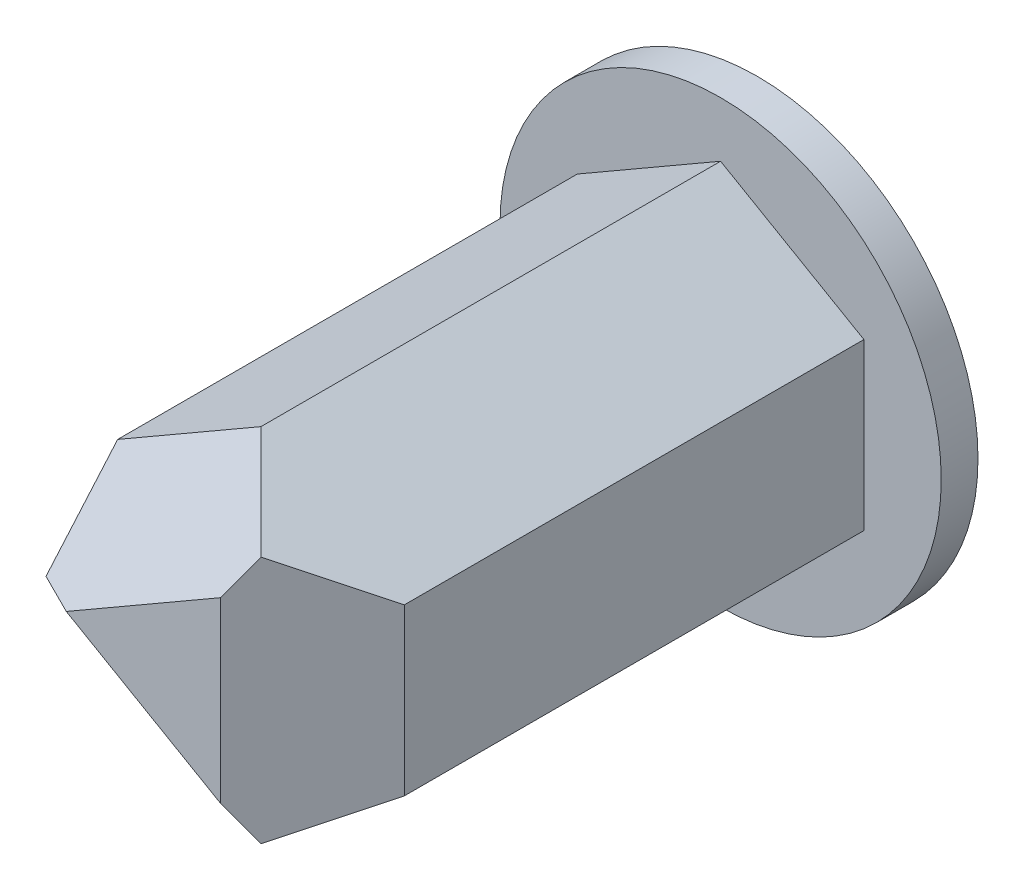
ISO-10303-21;
HEADER;
FILE_DESCRIPTION(('STEP AP214'),'2;1');
FILE_NAME('part.step','',(''),(''),'','','');
FILE_SCHEMA(('AUTOMOTIVE_DESIGN { 1 0 10303 214 1 1 1 1 }'));
ENDSEC;
DATA;
#1=APPLICATION_CONTEXT('core data for automotive mechanical design processes');
#2=APPLICATION_PROTOCOL_DEFINITION('international standard','automotive_design',2000,#1);
#3=PRODUCT_CONTEXT('',#1,'mechanical');
#4=PRODUCT('Part','Part','',(#3));
#5=PRODUCT_RELATED_PRODUCT_CATEGORY('part','',(#4));
#6=PRODUCT_DEFINITION_FORMATION('','',#4);
#7=PRODUCT_DEFINITION_CONTEXT('part definition',#1,'design');
#8=PRODUCT_DEFINITION('design','',#6,#7);
#9=PRODUCT_DEFINITION_SHAPE('','',#8);
#10=(LENGTH_UNIT() NAMED_UNIT(*) SI_UNIT(.MILLI.,.METRE.));
#11=(NAMED_UNIT(*) PLANE_ANGLE_UNIT() SI_UNIT($,.RADIAN.));
#12=(NAMED_UNIT(*) SI_UNIT($,.STERADIAN.) SOLID_ANGLE_UNIT());
#13=UNCERTAINTY_MEASURE_WITH_UNIT(LENGTH_MEASURE(1.E-05),#10,'distance_accuracy_value','');
#14=(GEOMETRIC_REPRESENTATION_CONTEXT(3) GLOBAL_UNCERTAINTY_ASSIGNED_CONTEXT((#13)) GLOBAL_UNIT_ASSIGNED_CONTEXT((#10,
#11,#12)) REPRESENTATION_CONTEXT('',''));
#15=CARTESIAN_POINT('',(0.,0.,0.));
#16=DIRECTION('',(0.,0.,1.));
#17=DIRECTION('',(1.,0.,0.));
#18=AXIS2_PLACEMENT_3D('',#15,#16,#17);
#19=CARTESIAN_POINT('',(7.79422863405988,4.50000000000008,30.));
#20=DIRECTION('',(-0.499999999999995,-0.866025403784441,0.));
#21=DIRECTION('',(0.866025403784441,-0.499999999999995,0.));
#22=AXIS2_PLACEMENT_3D('',#19,#20,#21);
#23=PLANE('',#22);
#24=DIRECTION('',(0.654653670707979,-0.377964473009223,0.654653670707978));
#25=VECTOR('',#24,1.);
#26=CARTESIAN_POINT('',(3.17225305227715,7.16849884633018,28.1722530522771));
#27=LINE('',#26,#25);
#28=CARTESIAN_POINT('',(0.,8.99999999999998,25.));
#29=VERTEX_POINT('',#28);
#30=CARTESIAN_POINT('',(3.89711431702994,6.75000000000003,28.8971143170299));
#31=VERTEX_POINT('',#30);
#32=EDGE_CURVE('E66',#29,#31,#27,.T.);
#33=ORIENTED_EDGE('',*,*,#32,.T.);
#34=DIRECTION('',(0.654653670707979,-0.377964473009223,-0.654653670707978));
#35=VECTOR('',#34,1.);
#36=CARTESIAN_POINT('',(4.62197558178273,6.33150115366988,28.1722530522771));
#37=LINE('',#36,#35);
#38=CARTESIAN_POINT('',(7.79422863405988,4.50000000000008,25.));
#39=VERTEX_POINT('',#38);
#40=EDGE_CURVE('E71',#31,#39,#37,.T.);
#41=ORIENTED_EDGE('',*,*,#40,.T.);
#42=DIRECTION('',(0.,0.,-1.));
#43=VECTOR('',#42,1.);
#44=CARTESIAN_POINT('',(7.79422863405988,4.50000000000008,30.));
#45=LINE('',#44,#43);
#46=CARTESIAN_POINT('',(7.79422863405988,4.50000000000008,0.));
#47=VERTEX_POINT('',#46);
#48=EDGE_CURVE('E144',#39,#47,#45,.T.);
#49=ORIENTED_EDGE('',*,*,#48,.T.);
#50=DIRECTION('',(-0.866025403784441,0.499999999999995,0.));
#51=VECTOR('',#50,1.);
#52=CARTESIAN_POINT('',(7.79422863405988,4.50000000000008,0.));
#53=LINE('',#52,#51);
#54=CARTESIAN_POINT('',(0.,8.99999999999998,0.));
#55=VERTEX_POINT('',#54);
#56=EDGE_CURVE('E137',#47,#55,#53,.T.);
#57=ORIENTED_EDGE('',*,*,#56,.T.);
#58=DIRECTION('',(0.,0.,-1.));
#59=VECTOR('',#58,1.);
#60=CARTESIAN_POINT('',(0.,8.99999999999998,30.));
#61=LINE('',#60,#59);
#62=EDGE_CURVE('E120',#29,#55,#61,.T.);
#63=ORIENTED_EDGE('',*,*,#62,.F.);
#64=EDGE_LOOP('',(#33,#41,#49,#57,#63));
#65=FACE_BOUND('',#64,.T.);
#66=ADVANCED_FACE('F47',(#65),#23,.F.);
#67=CARTESIAN_POINT('',(0.,8.99999999999998,30.));
#68=DIRECTION('',(0.500000000000001,-0.866025403784438,0.));
#69=DIRECTION('',(0.866025403784438,0.500000000000001,0.));
#70=AXIS2_PLACEMENT_3D('',#67,#68,#69);
#71=PLANE('',#70);
#72=DIRECTION('',(0.,0.,-1.));
#73=VECTOR('',#72,1.);
#74=CARTESIAN_POINT('',(-7.79422863405994,4.49999999999997,30.));
#75=LINE('',#74,#73);
#76=CARTESIAN_POINT('',(-7.79422863405994,4.49999999999997,25.));
#77=VERTEX_POINT('',#76);
#78=CARTESIAN_POINT('',(-7.79422863405994,4.49999999999997,0.));
#79=VERTEX_POINT('',#78);
#80=EDGE_CURVE('E129',#77,#79,#75,.T.);
#81=ORIENTED_EDGE('',*,*,#80,.F.);
#82=DIRECTION('',(0.866025403784438,0.500000000000001,0.));
#83=VECTOR('',#82,1.);
#84=CARTESIAN_POINT('',(0.,8.99999999999998,25.));
#85=LINE('',#84,#83);
#86=EDGE_CURVE('E11',#77,#29,#85,.T.);
#87=ORIENTED_EDGE('',*,*,#86,.T.);
#88=ORIENTED_EDGE('',*,*,#62,.T.);
#89=DIRECTION('',(-0.866025403784438,-0.500000000000001,0.));
#90=VECTOR('',#89,1.);
#91=CARTESIAN_POINT('',(0.,8.99999999999998,0.));
#92=LINE('',#91,#90);
#93=EDGE_CURVE('E124',#55,#79,#92,.T.);
#94=ORIENTED_EDGE('',*,*,#93,.T.);
#95=EDGE_LOOP('',(#81,#87,#88,#94));
#96=FACE_BOUND('',#95,.T.);
#97=ADVANCED_FACE('F123',(#96),#71,.F.);
#98=CARTESIAN_POINT('',(-7.79422863405994,4.49999999999997,30.));
#99=DIRECTION('',(1.,0.,0.));
#100=DIRECTION('',(0.,1.,0.));
#101=AXIS2_PLACEMENT_3D('',#98,#99,#100);
#102=PLANE('',#101);
#103=DIRECTION('',(0.,0.,-1.));
#104=VECTOR('',#103,1.);
#105=CARTESIAN_POINT('',(-7.79422863405991,-4.50000000000003,30.));
#106=LINE('',#105,#104);
#107=CARTESIAN_POINT('',(-7.79422863405991,-4.50000000000003,25.));
#108=VERTEX_POINT('',#107);
#109=CARTESIAN_POINT('',(-7.79422863405991,-4.50000000000003,0.));
#110=VERTEX_POINT('',#109);
#111=EDGE_CURVE('E175',#108,#110,#106,.T.);
#112=ORIENTED_EDGE('',*,*,#111,.F.);
#113=DIRECTION('',(0.,0.755928946018453,0.654653670707979));
#114=VECTOR('',#113,1.);
#115=CARTESIAN_POINT('',(-7.79422863405992,-0.836997692660354,28.1722530522772));
#116=LINE('',#115,#114);
#117=CARTESIAN_POINT('',(-7.79422863405993,0.,28.89711431703));
#118=VERTEX_POINT('',#117);
#119=EDGE_CURVE('E202',#108,#118,#116,.T.);
#120=ORIENTED_EDGE('',*,*,#119,.T.);
#121=DIRECTION('',(0.,0.755928946018453,-0.654653670707979));
#122=VECTOR('',#121,1.);
#123=CARTESIAN_POINT('',(-7.79422863405993,0.836997692660316,28.1722530522772));
#124=LINE('',#123,#122);
#125=EDGE_CURVE('E199',#118,#77,#124,.T.);
#126=ORIENTED_EDGE('',*,*,#125,.T.);
#127=ORIENTED_EDGE('',*,*,#80,.T.);
#128=DIRECTION('',(0.,-1.,0.));
#129=VECTOR('',#128,1.);
#130=CARTESIAN_POINT('',(-7.79422863405994,4.49999999999997,0.));
#131=LINE('',#130,#129);
#132=EDGE_CURVE('E141',#79,#110,#131,.T.);
#133=ORIENTED_EDGE('',*,*,#132,.T.);
#134=EDGE_LOOP('',(#112,#120,#126,#127,#133));
#135=FACE_BOUND('',#134,.T.);
#136=ADVANCED_FACE('F245',(#135),#102,.F.);
#137=CARTESIAN_POINT('',(-7.79422863405991,-4.50000000000003,30.));
#138=DIRECTION('',(0.499999999999995,0.866025403784442,0.));
#139=DIRECTION('',(-0.866025403784442,0.499999999999995,0.));
#140=AXIS2_PLACEMENT_3D('',#137,#138,#139);
#141=PLANE('',#140);
#142=DIRECTION('',(0.,0.,-1.));
#143=VECTOR('',#142,1.);
#144=CARTESIAN_POINT('',(0.,-8.99999999999998,30.));
#145=LINE('',#144,#143);
#146=CARTESIAN_POINT('',(0.,-8.99999999999998,25.));
#147=VERTEX_POINT('',#146);
#148=CARTESIAN_POINT('',(0.,-8.99999999999998,0.));
#149=VERTEX_POINT('',#148);
#150=EDGE_CURVE('E172',#147,#149,#145,.T.);
#151=ORIENTED_EDGE('',*,*,#150,.F.);
#152=DIRECTION('',(-0.866025403784442,0.499999999999995,0.));
#153=VECTOR('',#152,1.);
#154=CARTESIAN_POINT('',(-7.79422863405991,-4.50000000000003,25.));
#155=LINE('',#154,#153);
#156=EDGE_CURVE('E195',#147,#108,#155,.T.);
#157=ORIENTED_EDGE('',*,*,#156,.T.);
#158=ORIENTED_EDGE('',*,*,#111,.T.);
#159=DIRECTION('',(0.866025403784442,-0.499999999999995,0.));
#160=VECTOR('',#159,1.);
#161=CARTESIAN_POINT('',(-7.79422863405991,-4.50000000000003,0.));
#162=LINE('',#161,#160);
#163=EDGE_CURVE('E156',#110,#149,#162,.T.);
#164=ORIENTED_EDGE('',*,*,#163,.T.);
#165=EDGE_LOOP('',(#151,#157,#158,#164));
#166=FACE_BOUND('',#165,.T.);
#167=ADVANCED_FACE('F316',(#166),#141,.F.);
#168=CARTESIAN_POINT('',(0.,-8.99999999999998,30.));
#169=DIRECTION('',(-0.500000000000007,0.866025403784435,0.));
#170=DIRECTION('',(-0.866025403784435,-0.500000000000007,0.));
#171=AXIS2_PLACEMENT_3D('',#168,#169,#170);
#172=PLANE('',#171);
#173=DIRECTION('',(-0.654653670707973,-0.377964473009232,0.654653670707979));
#174=VECTOR('',#173,1.);
#175=CARTESIAN_POINT('',(4.62197558178283,-6.33150115366977,28.1722530522772));
#176=LINE('',#175,#174);
#177=CARTESIAN_POINT('',(7.79422863405997,-4.49999999999992,25.));
#178=VERTEX_POINT('',#177);
#179=CARTESIAN_POINT('',(3.89711431703003,-6.74999999999994,28.89711431703));
#180=VERTEX_POINT('',#179);
#181=EDGE_CURVE('E189',#178,#180,#176,.T.);
#182=ORIENTED_EDGE('',*,*,#181,.T.);
#183=DIRECTION('',(-0.654653670707973,-0.377964473009232,-0.654653670707979));
#184=VECTOR('',#183,1.);
#185=CARTESIAN_POINT('',(3.17225305227722,-7.16849884633012,28.1722530522772));
#186=LINE('',#185,#184);
#187=EDGE_CURVE('E192',#180,#147,#186,.T.);
#188=ORIENTED_EDGE('',*,*,#187,.T.);
#189=ORIENTED_EDGE('',*,*,#150,.T.);
#190=DIRECTION('',(0.866025403784435,0.500000000000007,0.));
#191=VECTOR('',#190,1.);
#192=CARTESIAN_POINT('',(0.,-8.99999999999998,0.));
#193=LINE('',#192,#191);
#194=CARTESIAN_POINT('',(7.79422863405997,-4.49999999999992,0.));
#195=VERTEX_POINT('',#194);
#196=EDGE_CURVE('E160',#149,#195,#193,.T.);
#197=ORIENTED_EDGE('',*,*,#196,.T.);
#198=DIRECTION('',(0.,0.,-1.));
#199=VECTOR('',#198,1.);
#200=CARTESIAN_POINT('',(7.79422863405997,-4.49999999999992,30.));
#201=LINE('',#200,#199);
#202=EDGE_CURVE('E169',#178,#195,#201,.T.);
#203=ORIENTED_EDGE('',*,*,#202,.F.);
#204=EDGE_LOOP('',(#182,#188,#189,#197,#203));
#205=FACE_BOUND('',#204,.T.);
#206=ADVANCED_FACE('F307',(#205),#172,.F.);
#207=CARTESIAN_POINT('',(7.79422863405997,-4.49999999999992,30.));
#208=DIRECTION('',(-1.,0.,0.));
#209=DIRECTION('',(0.,-1.,0.));
#210=AXIS2_PLACEMENT_3D('',#207,#208,#209);
#211=PLANE('',#210);
#212=ORIENTED_EDGE('',*,*,#48,.F.);
#213=DIRECTION('',(0.,-1.,0.));
#214=VECTOR('',#213,1.);
#215=CARTESIAN_POINT('',(7.79422863405997,-4.49999999999992,25.));
#216=LINE('',#215,#214);
#217=EDGE_CURVE('E58',#39,#178,#216,.T.);
#218=ORIENTED_EDGE('',*,*,#217,.T.);
#219=ORIENTED_EDGE('',*,*,#202,.T.);
#220=DIRECTION('',(0.,1.,0.));
#221=VECTOR('',#220,1.);
#222=CARTESIAN_POINT('',(7.79422863405997,-4.49999999999992,0.));
#223=LINE('',#222,#221);
#224=EDGE_CURVE('E164',#195,#47,#223,.T.);
#225=ORIENTED_EDGE('',*,*,#224,.T.);
#226=EDGE_LOOP('',(#212,#218,#219,#225));
#227=FACE_BOUND('',#226,.T.);
#228=ADVANCED_FACE('F298',(#227),#211,.F.);
#229=CARTESIAN_POINT('',(0.,0.,30.));
#230=DIRECTION('',(0.,0.,1.));
#231=DIRECTION('',(1.,0.,0.));
#232=AXIS2_PLACEMENT_3D('',#229,#230,#231);
#233=PLANE('',#232);
#234=DIRECTION('',(-0.866025403784438,-0.500000000000001,0.));
#235=VECTOR('',#234,1.);
#236=CARTESIAN_POINT('',(-5.29422863405994,0.169872981077789,30.));
#237=LINE('',#236,#235);
#238=CARTESIAN_POINT('',(2.79422863405989,4.83974596215557,30.));
#239=VERTEX_POINT('',#238);
#240=CARTESIAN_POINT('',(-5.58845726811988,0.,30.));
#241=VERTEX_POINT('',#240);
#242=EDGE_CURVE('E128',#239,#241,#237,.T.);
#243=ORIENTED_EDGE('',*,*,#242,.T.);
#244=DIRECTION('',(0.866025403784442,-0.499999999999995,0.));
#245=VECTOR('',#244,1.);
#246=CARTESIAN_POINT('',(2.50000000000004,-4.66987298107777,30.));
#247=LINE('',#246,#245);
#248=CARTESIAN_POINT('',(2.79422863405999,-4.83974596215557,30.));
#249=VERTEX_POINT('',#248);
#250=EDGE_CURVE('E185',#241,#249,#247,.T.);
#251=ORIENTED_EDGE('',*,*,#250,.T.);
#252=DIRECTION('',(0.,1.,0.));
#253=VECTOR('',#252,1.);
#254=CARTESIAN_POINT('',(2.79422863405989,4.50000000000003,30.));
#255=LINE('',#254,#253);
#256=EDGE_CURVE('E182',#249,#239,#255,.T.);
#257=ORIENTED_EDGE('',*,*,#256,.T.);
#258=EDGE_LOOP('',(#243,#251,#257));
#259=FACE_BOUND('',#258,.T.);
#260=ADVANCED_FACE('F291',(#259),#233,.T.);
#261=CARTESIAN_POINT('',(0.,0.,-2.));
#262=DIRECTION('',(0.,0.,1.));
#263=DIRECTION('',(1.,0.,0.));
#264=AXIS2_PLACEMENT_3D('',#261,#262,#263);
#265=CYLINDRICAL_SURFACE('',#264,12.);
#266=CARTESIAN_POINT('',(0.,0.,-2.));
#267=DIRECTION('',(0.,0.,-1.));
#268=DIRECTION('',(-1.,0.,0.));
#269=AXIS2_PLACEMENT_3D('',#266,#267,#268);
#270=CIRCLE('',#269,12.);
#271=CARTESIAN_POINT('',(-12.,0.,-2.));
#272=VERTEX_POINT('',#271);
#273=EDGE_CURVE('E146',#272,#272,#270,.T.);
#274=ORIENTED_EDGE('',*,*,#273,.F.);
#275=EDGE_LOOP('',(#274));
#276=FACE_BOUND('',#275,.T.);
#277=CARTESIAN_POINT('',(0.,0.,0.));
#278=DIRECTION('',(0.,0.,-1.));
#279=DIRECTION('',(-1.,0.,0.));
#280=AXIS2_PLACEMENT_3D('',#277,#278,#279);
#281=CIRCLE('',#280,12.);
#282=CARTESIAN_POINT('',(-12.,0.,0.));
#283=VERTEX_POINT('',#282);
#284=EDGE_CURVE('E150',#283,#283,#281,.T.);
#285=ORIENTED_EDGE('',*,*,#284,.T.);
#286=EDGE_LOOP('',(#285));
#287=FACE_BOUND('',#286,.T.);
#288=ADVANCED_FACE('F227',(#276,#287),#265,.T.);
#289=CARTESIAN_POINT('',(0.,0.,-2.));
#290=DIRECTION('',(0.,0.,-1.));
#291=DIRECTION('',(-1.,0.,0.));
#292=AXIS2_PLACEMENT_3D('',#289,#290,#291);
#293=PLANE('',#292);
#294=ORIENTED_EDGE('',*,*,#273,.T.);
#295=EDGE_LOOP('',(#294));
#296=FACE_BOUND('',#295,.T.);
#297=ADVANCED_FACE('F229',(#296),#293,.T.);
#298=CARTESIAN_POINT('',(0.,0.,0.));
#299=DIRECTION('',(0.,0.,-1.));
#300=DIRECTION('',(-1.,0.,0.));
#301=AXIS2_PLACEMENT_3D('',#298,#299,#300);
#302=PLANE('',#301);
#303=ORIENTED_EDGE('',*,*,#56,.F.);
#304=ORIENTED_EDGE('',*,*,#224,.F.);
#305=ORIENTED_EDGE('',*,*,#196,.F.);
#306=ORIENTED_EDGE('',*,*,#163,.F.);
#307=ORIENTED_EDGE('',*,*,#132,.F.);
#308=ORIENTED_EDGE('',*,*,#93,.F.);
#309=EDGE_LOOP('',(#303,#304,#305,#306,#307,#308));
#310=FACE_BOUND('',#309,.T.);
#311=ORIENTED_EDGE('',*,*,#284,.F.);
#312=EDGE_LOOP('',(#311));
#313=FACE_BOUND('',#312,.T.);
#314=ADVANCED_FACE('F134',(#310,#313),#302,.F.);
#315=CARTESIAN_POINT('',(-1.39711431702997,2.41987298107779,30.));
#316=DIRECTION('',(-0.353553390593275,0.612372435695795,0.707106781186546));
#317=DIRECTION('',(0.866025403784438,0.500000000000001,0.));
#318=AXIS2_PLACEMENT_3D('',#315,#316,#317);
#319=PLANE('',#318);
#320=DIRECTION('',(-0.894427190999916,0.,-0.447213595499958));
#321=VECTOR('',#320,1.);
#322=CARTESIAN_POINT('',(-2.23538290724794,0.,31.676537180436));
#323=LINE('',#322,#321);
#324=EDGE_CURVE('E213',#241,#118,#323,.T.);
#325=ORIENTED_EDGE('',*,*,#324,.F.);
#326=ORIENTED_EDGE('',*,*,#242,.F.);
#327=DIRECTION('',(0.447213595499952,0.774596669241484,-0.447213595499962));
#328=VECTOR('',#327,1.);
#329=CARTESIAN_POINT('',(1.11769145362397,1.93589838486226,31.676537180436));
#330=LINE('',#329,#328);
#331=EDGE_CURVE('E52',#31,#239,#330,.F.);
#332=ORIENTED_EDGE('',*,*,#331,.F.);
#333=ORIENTED_EDGE('',*,*,#32,.F.);
#334=ORIENTED_EDGE('',*,*,#86,.F.);
#335=ORIENTED_EDGE('',*,*,#125,.F.);
#336=EDGE_LOOP('',(#325,#326,#332,#333,#334,#335));
#337=FACE_BOUND('',#336,.T.);
#338=ADVANCED_FACE('F50',(#337),#319,.T.);
#339=CARTESIAN_POINT('',(2.79422863405993,0.,30.));
#340=DIRECTION('',(0.707106781186549,0.,0.707106781186546));
#341=DIRECTION('',(0.,-1.,0.));
#342=AXIS2_PLACEMENT_3D('',#339,#340,#341);
#343=PLANE('',#342);
#344=ORIENTED_EDGE('',*,*,#331,.T.);
#345=ORIENTED_EDGE('',*,*,#256,.F.);
#346=DIRECTION('',(0.447213595499964,-0.77459666924148,-0.447213595499958));
#347=VECTOR('',#346,1.);
#348=CARTESIAN_POINT('',(1.117691453624,-1.93589838486222,31.676537180436));
#349=LINE('',#348,#347);
#350=EDGE_CURVE('E211',#180,#249,#349,.F.);
#351=ORIENTED_EDGE('',*,*,#350,.F.);
#352=ORIENTED_EDGE('',*,*,#181,.F.);
#353=ORIENTED_EDGE('',*,*,#217,.F.);
#354=ORIENTED_EDGE('',*,*,#40,.F.);
#355=EDGE_LOOP('',(#344,#345,#351,#352,#353,#354));
#356=FACE_BOUND('',#355,.T.);
#357=ADVANCED_FACE('F236',(#356),#343,.T.);
#358=CARTESIAN_POINT('',(-1.39711431702994,-2.41987298107779,30.));
#359=DIRECTION('',(-0.353553390593271,-0.612372435695798,0.707106781186546));
#360=DIRECTION('',(-0.866025403784442,0.499999999999995,0.));
#361=AXIS2_PLACEMENT_3D('',#358,#359,#360);
#362=PLANE('',#361);
#363=ORIENTED_EDGE('',*,*,#119,.F.);
#364=ORIENTED_EDGE('',*,*,#156,.F.);
#365=ORIENTED_EDGE('',*,*,#187,.F.);
#366=ORIENTED_EDGE('',*,*,#350,.T.);
#367=ORIENTED_EDGE('',*,*,#250,.F.);
#368=ORIENTED_EDGE('',*,*,#324,.T.);
#369=EDGE_LOOP('',(#363,#364,#365,#366,#367,#368));
#370=FACE_BOUND('',#369,.T.);
#371=ADVANCED_FACE('F250',(#370),#362,.T.);
#372=CLOSED_SHELL('',(#66,#97,#136,#167,#206,#228,#260,#288,#297,#314,#338,#357,#371));
#373=MANIFOLD_SOLID_BREP('B2',#372);
#374=ADVANCED_BREP_SHAPE_REPRESENTATION('',(#18,#373),#14);
#375=SHAPE_DEFINITION_REPRESENTATION(#9,#374);
ENDSEC;
END-ISO-10303-21;
